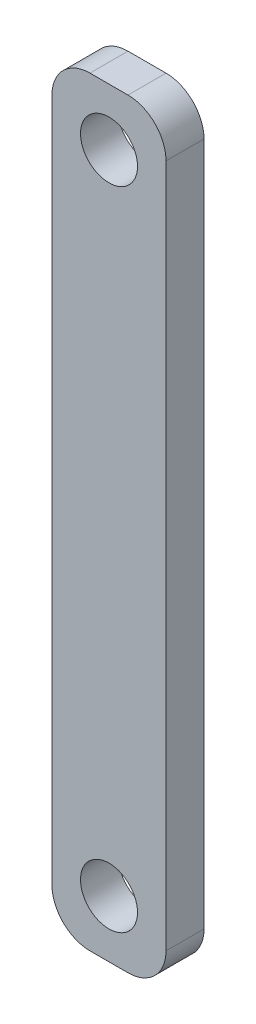
ISO-10303-21;
HEADER;
FILE_DESCRIPTION(('STEP AP214'),'2;1');
FILE_NAME('part.step','',(''),(''),'','','');
FILE_SCHEMA(('AUTOMOTIVE_DESIGN { 1 0 10303 214 1 1 1 1 }'));
ENDSEC;
DATA;
#1=APPLICATION_CONTEXT('core data for automotive mechanical design processes');
#2=APPLICATION_PROTOCOL_DEFINITION('international standard','automotive_design',2000,#1);
#3=PRODUCT_CONTEXT('',#1,'mechanical');
#4=PRODUCT('Part','Part','',(#3));
#5=PRODUCT_RELATED_PRODUCT_CATEGORY('part','',(#4));
#6=PRODUCT_DEFINITION_FORMATION('','',#4);
#7=PRODUCT_DEFINITION_CONTEXT('part definition',#1,'design');
#8=PRODUCT_DEFINITION('design','',#6,#7);
#9=PRODUCT_DEFINITION_SHAPE('','',#8);
#10=(LENGTH_UNIT() NAMED_UNIT(*) SI_UNIT(.MILLI.,.METRE.));
#11=(NAMED_UNIT(*) PLANE_ANGLE_UNIT() SI_UNIT($,.RADIAN.));
#12=(NAMED_UNIT(*) SI_UNIT($,.STERADIAN.) SOLID_ANGLE_UNIT());
#13=UNCERTAINTY_MEASURE_WITH_UNIT(LENGTH_MEASURE(1.E-05),#10,'distance_accuracy_value','');
#14=(GEOMETRIC_REPRESENTATION_CONTEXT(3) GLOBAL_UNCERTAINTY_ASSIGNED_CONTEXT((#13)) GLOBAL_UNIT_ASSIGNED_CONTEXT((#10,
#11,#12)) REPRESENTATION_CONTEXT('',''));
#15=CARTESIAN_POINT('',(0.,0.,0.));
#16=DIRECTION('',(0.,0.,1.));
#17=DIRECTION('',(1.,0.,0.));
#18=AXIS2_PLACEMENT_3D('',#15,#16,#17);
#19=CARTESIAN_POINT('',(0.,0.,2.));
#20=DIRECTION('',(0.,0.,-1.));
#21=DIRECTION('',(-1.,0.,0.));
#22=AXIS2_PLACEMENT_3D('',#19,#20,#21);
#23=PLANE('',#22);
#24=DIRECTION('',(0.,-1.,0.));
#25=VECTOR('',#24,1.);
#26=CARTESIAN_POINT('',(-3.,-20.,2.));
#27=LINE('',#26,#25);
#28=CARTESIAN_POINT('',(-3.,18.,2.));
#29=VERTEX_POINT('',#28);
#30=CARTESIAN_POINT('',(-3.,-18.,2.));
#31=VERTEX_POINT('',#30);
#32=EDGE_CURVE('E163',#29,#31,#27,.T.);
#33=ORIENTED_EDGE('',*,*,#32,.T.);
#34=CARTESIAN_POINT('',(-0.999999999999999,-18.,2.));
#35=DIRECTION('',(0.,0.,-1.));
#36=DIRECTION('',(-1.,0.,0.));
#37=AXIS2_PLACEMENT_3D('',#34,#35,#36);
#38=CIRCLE('',#37,2.);
#39=CARTESIAN_POINT('',(-0.999999999999999,-20.,2.));
#40=VERTEX_POINT('',#39);
#41=EDGE_CURVE('E146',#31,#40,#38,.F.);
#42=ORIENTED_EDGE('',*,*,#41,.T.);
#43=DIRECTION('',(1.,0.,0.));
#44=VECTOR('',#43,1.);
#45=CARTESIAN_POINT('',(-3.,-20.,2.));
#46=LINE('',#45,#44);
#47=CARTESIAN_POINT('',(1.,-20.,2.));
#48=VERTEX_POINT('',#47);
#49=EDGE_CURVE('E117',#40,#48,#46,.T.);
#50=ORIENTED_EDGE('',*,*,#49,.T.);
#51=CARTESIAN_POINT('',(1.,-18.,2.));
#52=DIRECTION('',(0.,0.,-1.));
#53=DIRECTION('',(-1.,0.,0.));
#54=AXIS2_PLACEMENT_3D('',#51,#52,#53);
#55=CIRCLE('',#54,2.);
#56=CARTESIAN_POINT('',(3.,-18.,2.));
#57=VERTEX_POINT('',#56);
#58=EDGE_CURVE('E144',#48,#57,#55,.F.);
#59=ORIENTED_EDGE('',*,*,#58,.T.);
#60=DIRECTION('',(0.,1.,0.));
#61=VECTOR('',#60,1.);
#62=CARTESIAN_POINT('',(3.,-20.,2.));
#63=LINE('',#62,#61);
#64=CARTESIAN_POINT('',(3.,18.,2.));
#65=VERTEX_POINT('',#64);
#66=EDGE_CURVE('E124',#57,#65,#63,.T.);
#67=ORIENTED_EDGE('',*,*,#66,.T.);
#68=CARTESIAN_POINT('',(1.,18.,2.));
#69=DIRECTION('',(0.,0.,-1.));
#70=DIRECTION('',(-1.,0.,0.));
#71=AXIS2_PLACEMENT_3D('',#68,#69,#70);
#72=CIRCLE('',#71,2.);
#73=CARTESIAN_POINT('',(1.,20.,2.));
#74=VERTEX_POINT('',#73);
#75=EDGE_CURVE('E52',#65,#74,#72,.F.);
#76=ORIENTED_EDGE('',*,*,#75,.T.);
#77=DIRECTION('',(-1.,0.,0.));
#78=VECTOR('',#77,1.);
#79=CARTESIAN_POINT('',(-3.,20.,2.));
#80=LINE('',#79,#78);
#81=CARTESIAN_POINT('',(-0.999999999999999,20.,2.));
#82=VERTEX_POINT('',#81);
#83=EDGE_CURVE('E127',#74,#82,#80,.T.);
#84=ORIENTED_EDGE('',*,*,#83,.T.);
#85=CARTESIAN_POINT('',(-0.999999999999999,18.,2.));
#86=DIRECTION('',(0.,0.,-1.));
#87=DIRECTION('',(-1.,0.,0.));
#88=AXIS2_PLACEMENT_3D('',#85,#86,#87);
#89=CIRCLE('',#88,2.);
#90=EDGE_CURVE('E142',#82,#29,#89,.F.);
#91=ORIENTED_EDGE('',*,*,#90,.T.);
#92=EDGE_LOOP('',(#33,#42,#50,#59,#67,#76,#84,#91));
#93=FACE_BOUND('',#92,.T.);
#94=CARTESIAN_POINT('',(0.,17.,2.));
#95=DIRECTION('',(0.,0.,1.));
#96=DIRECTION('',(1.,0.,0.));
#97=AXIS2_PLACEMENT_3D('',#94,#95,#96);
#98=CIRCLE('',#97,1.5);
#99=CARTESIAN_POINT('',(1.5,17.,2.));
#100=VERTEX_POINT('',#99);
#101=EDGE_CURVE('E159',#100,#100,#98,.T.);
#102=ORIENTED_EDGE('',*,*,#101,.F.);
#103=EDGE_LOOP('',(#102));
#104=FACE_BOUND('',#103,.T.);
#105=CARTESIAN_POINT('',(0.,-17.,2.));
#106=DIRECTION('',(0.,0.,1.));
#107=DIRECTION('',(1.,0.,0.));
#108=AXIS2_PLACEMENT_3D('',#105,#106,#107);
#109=CIRCLE('',#108,1.5);
#110=CARTESIAN_POINT('',(1.5,-17.,2.));
#111=VERTEX_POINT('',#110);
#112=EDGE_CURVE('E170',#111,#111,#109,.T.);
#113=ORIENTED_EDGE('',*,*,#112,.F.);
#114=EDGE_LOOP('',(#113));
#115=FACE_BOUND('',#114,.T.);
#116=ADVANCED_FACE('F32',(#93,#104,#115),#23,.F.);
#117=CARTESIAN_POINT('',(0.,0.,0.));
#118=DIRECTION('',(0.,0.,-1.));
#119=DIRECTION('',(-1.,0.,0.));
#120=AXIS2_PLACEMENT_3D('',#117,#118,#119);
#121=PLANE('',#120);
#122=CARTESIAN_POINT('',(0.,17.,0.));
#123=DIRECTION('',(0.,0.,1.));
#124=DIRECTION('',(1.,0.,0.));
#125=AXIS2_PLACEMENT_3D('',#122,#123,#124);
#126=CIRCLE('',#125,1.5);
#127=CARTESIAN_POINT('',(1.5,17.,0.));
#128=VERTEX_POINT('',#127);
#129=EDGE_CURVE('E167',#128,#128,#126,.T.);
#130=ORIENTED_EDGE('',*,*,#129,.T.);
#131=EDGE_LOOP('',(#130));
#132=FACE_BOUND('',#131,.T.);
#133=DIRECTION('',(1.,0.,0.));
#134=VECTOR('',#133,1.);
#135=CARTESIAN_POINT('',(-3.,-20.,0.));
#136=LINE('',#135,#134);
#137=CARTESIAN_POINT('',(-0.999999999999999,-20.,0.));
#138=VERTEX_POINT('',#137);
#139=CARTESIAN_POINT('',(1.,-20.,0.));
#140=VERTEX_POINT('',#139);
#141=EDGE_CURVE('E114',#138,#140,#136,.T.);
#142=ORIENTED_EDGE('',*,*,#141,.F.);
#143=CARTESIAN_POINT('',(-0.999999999999999,-18.,0.));
#144=DIRECTION('',(0.,0.,-1.));
#145=DIRECTION('',(-1.,0.,0.));
#146=AXIS2_PLACEMENT_3D('',#143,#144,#145);
#147=CIRCLE('',#146,2.);
#148=CARTESIAN_POINT('',(-3.,-18.,0.));
#149=VERTEX_POINT('',#148);
#150=EDGE_CURVE('E97',#138,#149,#147,.T.);
#151=ORIENTED_EDGE('',*,*,#150,.T.);
#152=DIRECTION('',(0.,-1.,0.));
#153=VECTOR('',#152,1.);
#154=CARTESIAN_POINT('',(-3.,-20.,0.));
#155=LINE('',#154,#153);
#156=CARTESIAN_POINT('',(-3.,18.,0.));
#157=VERTEX_POINT('',#156);
#158=EDGE_CURVE('E125',#157,#149,#155,.T.);
#159=ORIENTED_EDGE('',*,*,#158,.F.);
#160=CARTESIAN_POINT('',(-0.999999999999999,18.,0.));
#161=DIRECTION('',(0.,0.,-1.));
#162=DIRECTION('',(-1.,0.,0.));
#163=AXIS2_PLACEMENT_3D('',#160,#161,#162);
#164=CIRCLE('',#163,2.);
#165=CARTESIAN_POINT('',(-0.999999999999999,20.,0.));
#166=VERTEX_POINT('',#165);
#167=EDGE_CURVE('E135',#157,#166,#164,.T.);
#168=ORIENTED_EDGE('',*,*,#167,.T.);
#169=DIRECTION('',(-1.,0.,0.));
#170=VECTOR('',#169,1.);
#171=CARTESIAN_POINT('',(-3.,20.,0.));
#172=LINE('',#171,#170);
#173=CARTESIAN_POINT('',(1.,20.,0.));
#174=VERTEX_POINT('',#173);
#175=EDGE_CURVE('E129',#174,#166,#172,.T.);
#176=ORIENTED_EDGE('',*,*,#175,.F.);
#177=CARTESIAN_POINT('',(1.,18.,0.));
#178=DIRECTION('',(0.,0.,-1.));
#179=DIRECTION('',(-1.,0.,0.));
#180=AXIS2_PLACEMENT_3D('',#177,#178,#179);
#181=CIRCLE('',#180,2.);
#182=CARTESIAN_POINT('',(3.,18.,0.));
#183=VERTEX_POINT('',#182);
#184=EDGE_CURVE('E118',#174,#183,#181,.T.);
#185=ORIENTED_EDGE('',*,*,#184,.T.);
#186=DIRECTION('',(0.,1.,0.));
#187=VECTOR('',#186,1.);
#188=CARTESIAN_POINT('',(3.,-20.,0.));
#189=LINE('',#188,#187);
#190=CARTESIAN_POINT('',(3.,-18.,0.));
#191=VERTEX_POINT('',#190);
#192=EDGE_CURVE('E158',#191,#183,#189,.T.);
#193=ORIENTED_EDGE('',*,*,#192,.F.);
#194=CARTESIAN_POINT('',(1.,-18.,0.));
#195=DIRECTION('',(0.,0.,-1.));
#196=DIRECTION('',(-1.,0.,0.));
#197=AXIS2_PLACEMENT_3D('',#194,#195,#196);
#198=CIRCLE('',#197,2.);
#199=EDGE_CURVE('E108',#191,#140,#198,.T.);
#200=ORIENTED_EDGE('',*,*,#199,.T.);
#201=EDGE_LOOP('',(#142,#151,#159,#168,#176,#185,#193,#200));
#202=FACE_BOUND('',#201,.T.);
#203=CARTESIAN_POINT('',(0.,-17.,0.));
#204=DIRECTION('',(0.,0.,1.));
#205=DIRECTION('',(1.,0.,0.));
#206=AXIS2_PLACEMENT_3D('',#203,#204,#205);
#207=CIRCLE('',#206,1.5);
#208=CARTESIAN_POINT('',(1.5,-17.,0.));
#209=VERTEX_POINT('',#208);
#210=EDGE_CURVE('E173',#209,#209,#207,.T.);
#211=ORIENTED_EDGE('',*,*,#210,.T.);
#212=EDGE_LOOP('',(#211));
#213=FACE_BOUND('',#212,.T.);
#214=ADVANCED_FACE('F121',(#132,#202,#213),#121,.T.);
#215=CARTESIAN_POINT('',(3.,-20.,2.));
#216=DIRECTION('',(-1.,0.,0.));
#217=DIRECTION('',(0.,0.,1.));
#218=AXIS2_PLACEMENT_3D('',#215,#216,#217);
#219=PLANE('',#218);
#220=ORIENTED_EDGE('',*,*,#66,.F.);
#221=DIRECTION('',(0.,0.,-1.));
#222=VECTOR('',#221,1.);
#223=CARTESIAN_POINT('',(3.,-18.,2.));
#224=LINE('',#223,#222);
#225=EDGE_CURVE('E150',#57,#191,#224,.T.);
#226=ORIENTED_EDGE('',*,*,#225,.T.);
#227=ORIENTED_EDGE('',*,*,#192,.T.);
#228=DIRECTION('',(0.,0.,-1.));
#229=VECTOR('',#228,1.);
#230=CARTESIAN_POINT('',(3.,18.,2.));
#231=LINE('',#230,#229);
#232=EDGE_CURVE('E148',#183,#65,#231,.F.);
#233=ORIENTED_EDGE('',*,*,#232,.T.);
#234=EDGE_LOOP('',(#220,#226,#227,#233));
#235=FACE_BOUND('',#234,.T.);
#236=ADVANCED_FACE('F187',(#235),#219,.F.);
#237=CARTESIAN_POINT('',(-3.,20.,2.));
#238=DIRECTION('',(0.,-1.,0.));
#239=DIRECTION('',(0.,0.,-1.));
#240=AXIS2_PLACEMENT_3D('',#237,#238,#239);
#241=PLANE('',#240);
#242=ORIENTED_EDGE('',*,*,#175,.T.);
#243=DIRECTION('',(0.,0.,-1.));
#244=VECTOR('',#243,1.);
#245=CARTESIAN_POINT('',(-0.999999999999999,20.,2.));
#246=LINE('',#245,#244);
#247=EDGE_CURVE('E11',#166,#82,#246,.F.);
#248=ORIENTED_EDGE('',*,*,#247,.T.);
#249=ORIENTED_EDGE('',*,*,#83,.F.);
#250=DIRECTION('',(0.,0.,-1.));
#251=VECTOR('',#250,1.);
#252=CARTESIAN_POINT('',(1.,20.,2.));
#253=LINE('',#252,#251);
#254=EDGE_CURVE('E40',#74,#174,#253,.T.);
#255=ORIENTED_EDGE('',*,*,#254,.T.);
#256=EDGE_LOOP('',(#242,#248,#249,#255));
#257=FACE_BOUND('',#256,.T.);
#258=ADVANCED_FACE('F155',(#257),#241,.F.);
#259=CARTESIAN_POINT('',(-3.,-20.,2.));
#260=DIRECTION('',(1.,0.,0.));
#261=DIRECTION('',(0.,0.,-1.));
#262=AXIS2_PLACEMENT_3D('',#259,#260,#261);
#263=PLANE('',#262);
#264=ORIENTED_EDGE('',*,*,#158,.T.);
#265=DIRECTION('',(0.,0.,-1.));
#266=VECTOR('',#265,1.);
#267=CARTESIAN_POINT('',(-3.,-18.,2.));
#268=LINE('',#267,#266);
#269=EDGE_CURVE('E102',#149,#31,#268,.F.);
#270=ORIENTED_EDGE('',*,*,#269,.T.);
#271=ORIENTED_EDGE('',*,*,#32,.F.);
#272=DIRECTION('',(0.,0.,-1.));
#273=VECTOR('',#272,1.);
#274=CARTESIAN_POINT('',(-3.,18.,2.));
#275=LINE('',#274,#273);
#276=EDGE_CURVE('E107',#29,#157,#275,.T.);
#277=ORIENTED_EDGE('',*,*,#276,.T.);
#278=EDGE_LOOP('',(#264,#270,#271,#277));
#279=FACE_BOUND('',#278,.T.);
#280=ADVANCED_FACE('F197',(#279),#263,.F.);
#281=CARTESIAN_POINT('',(-3.,-20.,2.));
#282=DIRECTION('',(0.,1.,0.));
#283=DIRECTION('',(0.,0.,1.));
#284=AXIS2_PLACEMENT_3D('',#281,#282,#283);
#285=PLANE('',#284);
#286=ORIENTED_EDGE('',*,*,#49,.F.);
#287=DIRECTION('',(0.,0.,-1.));
#288=VECTOR('',#287,1.);
#289=CARTESIAN_POINT('',(-0.999999999999999,-20.,2.));
#290=LINE('',#289,#288);
#291=EDGE_CURVE('E101',#40,#138,#290,.T.);
#292=ORIENTED_EDGE('',*,*,#291,.T.);
#293=ORIENTED_EDGE('',*,*,#141,.T.);
#294=DIRECTION('',(0.,0.,-1.));
#295=VECTOR('',#294,1.);
#296=CARTESIAN_POINT('',(1.,-20.,2.));
#297=LINE('',#296,#295);
#298=EDGE_CURVE('E119',#140,#48,#297,.F.);
#299=ORIENTED_EDGE('',*,*,#298,.T.);
#300=EDGE_LOOP('',(#286,#292,#293,#299));
#301=FACE_BOUND('',#300,.T.);
#302=ADVANCED_FACE('F113',(#301),#285,.F.);
#303=CARTESIAN_POINT('',(0.,17.,2.));
#304=DIRECTION('',(0.,0.,-1.));
#305=DIRECTION('',(-1.,0.,0.));
#306=AXIS2_PLACEMENT_3D('',#303,#304,#305);
#307=CYLINDRICAL_SURFACE('',#306,1.5);
#308=ORIENTED_EDGE('',*,*,#101,.T.);
#309=EDGE_LOOP('',(#308));
#310=FACE_BOUND('',#309,.T.);
#311=ORIENTED_EDGE('',*,*,#129,.F.);
#312=EDGE_LOOP('',(#311));
#313=FACE_BOUND('',#312,.T.);
#314=ADVANCED_FACE('F192',(#310,#313),#307,.F.);
#315=CARTESIAN_POINT('',(0.,-17.,2.));
#316=DIRECTION('',(0.,0.,-1.));
#317=DIRECTION('',(-1.,0.,0.));
#318=AXIS2_PLACEMENT_3D('',#315,#316,#317);
#319=CYLINDRICAL_SURFACE('',#318,1.5);
#320=ORIENTED_EDGE('',*,*,#112,.T.);
#321=EDGE_LOOP('',(#320));
#322=FACE_BOUND('',#321,.T.);
#323=ORIENTED_EDGE('',*,*,#210,.F.);
#324=EDGE_LOOP('',(#323));
#325=FACE_BOUND('',#324,.T.);
#326=ADVANCED_FACE('F179',(#322,#325),#319,.F.);
#327=CARTESIAN_POINT('',(-0.999999999999999,-18.,2.));
#328=DIRECTION('',(0.,0.,-1.));
#329=DIRECTION('',(-1.,0.,0.));
#330=AXIS2_PLACEMENT_3D('',#327,#328,#329);
#331=CYLINDRICAL_SURFACE('',#330,2.);
#332=ORIENTED_EDGE('',*,*,#41,.F.);
#333=ORIENTED_EDGE('',*,*,#269,.F.);
#334=ORIENTED_EDGE('',*,*,#150,.F.);
#335=ORIENTED_EDGE('',*,*,#291,.F.);
#336=EDGE_LOOP('',(#332,#333,#334,#335));
#337=FACE_BOUND('',#336,.T.);
#338=ADVANCED_FACE('F100',(#337),#331,.T.);
#339=CARTESIAN_POINT('',(1.,-18.,2.));
#340=DIRECTION('',(0.,0.,-1.));
#341=DIRECTION('',(-1.,0.,0.));
#342=AXIS2_PLACEMENT_3D('',#339,#340,#341);
#343=CYLINDRICAL_SURFACE('',#342,2.);
#344=ORIENTED_EDGE('',*,*,#58,.F.);
#345=ORIENTED_EDGE('',*,*,#298,.F.);
#346=ORIENTED_EDGE('',*,*,#199,.F.);
#347=ORIENTED_EDGE('',*,*,#225,.F.);
#348=EDGE_LOOP('',(#344,#345,#346,#347));
#349=FACE_BOUND('',#348,.T.);
#350=ADVANCED_FACE('F208',(#349),#343,.T.);
#351=CARTESIAN_POINT('',(-0.999999999999999,18.,2.));
#352=DIRECTION('',(0.,0.,-1.));
#353=DIRECTION('',(-1.,0.,0.));
#354=AXIS2_PLACEMENT_3D('',#351,#352,#353);
#355=CYLINDRICAL_SURFACE('',#354,2.);
#356=ORIENTED_EDGE('',*,*,#90,.F.);
#357=ORIENTED_EDGE('',*,*,#247,.F.);
#358=ORIENTED_EDGE('',*,*,#167,.F.);
#359=ORIENTED_EDGE('',*,*,#276,.F.);
#360=EDGE_LOOP('',(#356,#357,#358,#359));
#361=FACE_BOUND('',#360,.T.);
#362=ADVANCED_FACE('F210',(#361),#355,.T.);
#363=CARTESIAN_POINT('',(1.,18.,2.));
#364=DIRECTION('',(0.,0.,-1.));
#365=DIRECTION('',(-1.,0.,0.));
#366=AXIS2_PLACEMENT_3D('',#363,#364,#365);
#367=CYLINDRICAL_SURFACE('',#366,2.);
#368=ORIENTED_EDGE('',*,*,#75,.F.);
#369=ORIENTED_EDGE('',*,*,#232,.F.);
#370=ORIENTED_EDGE('',*,*,#184,.F.);
#371=ORIENTED_EDGE('',*,*,#254,.F.);
#372=EDGE_LOOP('',(#368,#369,#370,#371));
#373=FACE_BOUND('',#372,.T.);
#374=ADVANCED_FACE('F34',(#373),#367,.T.);
#375=CLOSED_SHELL('',(#116,#214,#236,#258,#280,#302,#314,#326,#338,#350,#362,#374));
#376=MANIFOLD_SOLID_BREP('B2',#375);
#377=ADVANCED_BREP_SHAPE_REPRESENTATION('',(#18,#376),#14);
#378=SHAPE_DEFINITION_REPRESENTATION(#9,#377);
ENDSEC;
END-ISO-10303-21;
